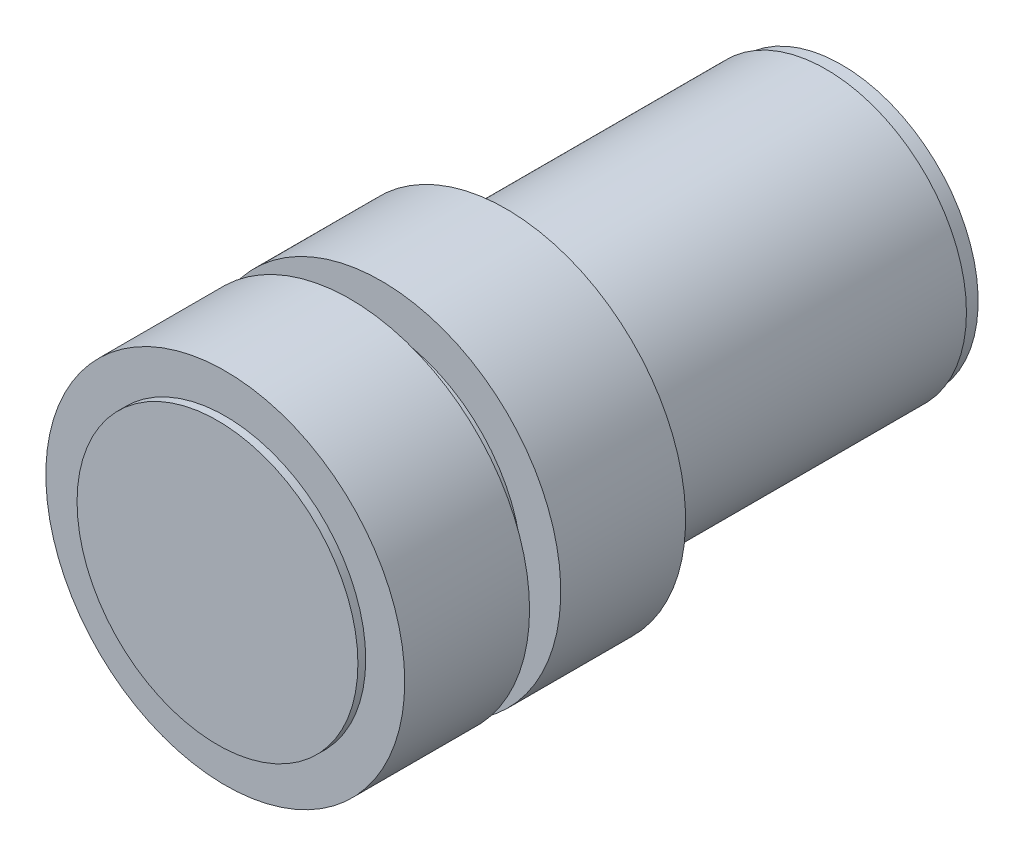
ISO-10303-21;
HEADER;
FILE_DESCRIPTION(('STEP AP214'),'2;1');
FILE_NAME('part.step','',(''),(''),'','','');
FILE_SCHEMA(('AUTOMOTIVE_DESIGN { 1 0 10303 214 1 1 1 1 }'));
ENDSEC;
DATA;
#1=APPLICATION_CONTEXT('core data for automotive mechanical design processes');
#2=APPLICATION_PROTOCOL_DEFINITION('international standard','automotive_design',2000,#1);
#3=PRODUCT_CONTEXT('',#1,'mechanical');
#4=PRODUCT('Part','Part','',(#3));
#5=PRODUCT_RELATED_PRODUCT_CATEGORY('part','',(#4));
#6=PRODUCT_DEFINITION_FORMATION('','',#4);
#7=PRODUCT_DEFINITION_CONTEXT('part definition',#1,'design');
#8=PRODUCT_DEFINITION('design','',#6,#7);
#9=PRODUCT_DEFINITION_SHAPE('','',#8);
#10=(LENGTH_UNIT() NAMED_UNIT(*) SI_UNIT(.MILLI.,.METRE.));
#11=(NAMED_UNIT(*) PLANE_ANGLE_UNIT() SI_UNIT($,.RADIAN.));
#12=(NAMED_UNIT(*) SI_UNIT($,.STERADIAN.) SOLID_ANGLE_UNIT());
#13=UNCERTAINTY_MEASURE_WITH_UNIT(LENGTH_MEASURE(1.E-05),#10,'distance_accuracy_value','');
#14=(GEOMETRIC_REPRESENTATION_CONTEXT(3) GLOBAL_UNCERTAINTY_ASSIGNED_CONTEXT((#13)) GLOBAL_UNIT_ASSIGNED_CONTEXT((#10,
#11,#12)) REPRESENTATION_CONTEXT('',''));
#15=CARTESIAN_POINT('',(0.,0.,0.));
#16=DIRECTION('',(0.,0.,1.));
#17=DIRECTION('',(1.,0.,0.));
#18=AXIS2_PLACEMENT_3D('',#15,#16,#17);
#19=CARTESIAN_POINT('',(0.,0.,40.));
#20=DIRECTION('',(0.,0.,-1.));
#21=DIRECTION('',(-1.,0.,0.));
#22=AXIS2_PLACEMENT_3D('',#19,#20,#21);
#23=CYLINDRICAL_SURFACE('',#22,9.);
#24=CARTESIAN_POINT('',(0.,0.,21.5));
#25=DIRECTION('',(0.,0.,-1.));
#26=DIRECTION('',(-1.,0.,0.));
#27=AXIS2_PLACEMENT_3D('',#24,#25,#26);
#28=CIRCLE('',#27,9.);
#29=CARTESIAN_POINT('',(-9.,0.,21.5));
#30=VERTEX_POINT('',#29);
#31=EDGE_CURVE('E36',#30,#30,#28,.T.);
#32=ORIENTED_EDGE('',*,*,#31,.T.);
#33=EDGE_LOOP('',(#32));
#34=FACE_BOUND('',#33,.T.);
#35=CARTESIAN_POINT('',(0.,0.,1.));
#36=DIRECTION('',(0.,0.,-1.));
#37=DIRECTION('',(-1.,0.,0.));
#38=AXIS2_PLACEMENT_3D('',#35,#36,#37);
#39=CIRCLE('',#38,9.);
#40=CARTESIAN_POINT('',(-9.,0.,1.));
#41=VERTEX_POINT('',#40);
#42=EDGE_CURVE('E62',#41,#41,#39,.T.);
#43=ORIENTED_EDGE('',*,*,#42,.F.);
#44=EDGE_LOOP('',(#43));
#45=FACE_BOUND('',#44,.T.);
#46=ADVANCED_FACE('F32',(#34,#45),#23,.T.);
#47=CARTESIAN_POINT('',(0.,0.,31.5));
#48=DIRECTION('',(0.,0.,1.));
#49=DIRECTION('',(1.,0.,0.));
#50=AXIS2_PLACEMENT_3D('',#47,#48,#49);
#51=CIRCLE('',#50,9.);
#52=CARTESIAN_POINT('',(9.,0.,31.5));
#53=VERTEX_POINT('',#52);
#54=EDGE_CURVE('E40',#53,#53,#51,.T.);
#55=ORIENTED_EDGE('',*,*,#54,.F.);
#56=EDGE_LOOP('',(#55));
#57=FACE_BOUND('',#56,.T.);
#58=CARTESIAN_POINT('',(0.,0.,29.5));
#59=DIRECTION('',(0.,0.,-1.));
#60=DIRECTION('',(-1.,0.,0.));
#61=AXIS2_PLACEMENT_3D('',#58,#59,#60);
#62=CIRCLE('',#61,9.);
#63=CARTESIAN_POINT('',(-9.,0.,29.5));
#64=VERTEX_POINT('',#63);
#65=EDGE_CURVE('E10',#64,#64,#62,.T.);
#66=ORIENTED_EDGE('',*,*,#65,.F.);
#67=EDGE_LOOP('',(#66));
#68=FACE_BOUND('',#67,.T.);
#69=ADVANCED_FACE('F85',(#57,#68),#23,.T.);
#70=CARTESIAN_POINT('',(0.,0.,31.5));
#71=DIRECTION('',(0.,0.,1.));
#72=DIRECTION('',(1.,0.,0.));
#73=AXIS2_PLACEMENT_3D('',#70,#71,#72);
#74=CYLINDRICAL_SURFACE('',#73,11.5);
#75=CARTESIAN_POINT('',(0.,0.,31.5));
#76=DIRECTION('',(0.,0.,1.));
#77=DIRECTION('',(1.,0.,0.));
#78=AXIS2_PLACEMENT_3D('',#75,#76,#77);
#79=CIRCLE('',#78,11.5);
#80=CARTESIAN_POINT('',(11.5,0.,31.5));
#81=VERTEX_POINT('',#80);
#82=EDGE_CURVE('E50',#81,#81,#79,.T.);
#83=ORIENTED_EDGE('',*,*,#82,.T.);
#84=EDGE_LOOP('',(#83));
#85=FACE_BOUND('',#84,.T.);
#86=CARTESIAN_POINT('',(0.,0.,39.5));
#87=DIRECTION('',(0.,0.,1.));
#88=DIRECTION('',(1.,0.,0.));
#89=AXIS2_PLACEMENT_3D('',#86,#87,#88);
#90=CIRCLE('',#89,11.5);
#91=CARTESIAN_POINT('',(11.5,0.,39.5));
#92=VERTEX_POINT('',#91);
#93=EDGE_CURVE('E53',#92,#92,#90,.T.);
#94=ORIENTED_EDGE('',*,*,#93,.F.);
#95=EDGE_LOOP('',(#94));
#96=FACE_BOUND('',#95,.T.);
#97=ADVANCED_FACE('F90',(#85,#96),#74,.T.);
#98=CARTESIAN_POINT('',(0.,0.,31.5));
#99=DIRECTION('',(0.,0.,1.));
#100=DIRECTION('',(1.,0.,0.));
#101=AXIS2_PLACEMENT_3D('',#98,#99,#100);
#102=PLANE('',#101);
#103=ORIENTED_EDGE('',*,*,#54,.T.);
#104=EDGE_LOOP('',(#103));
#105=FACE_BOUND('',#104,.T.);
#106=ORIENTED_EDGE('',*,*,#82,.F.);
#107=EDGE_LOOP('',(#106));
#108=FACE_BOUND('',#107,.T.);
#109=ADVANCED_FACE('F113',(#105,#108),#102,.F.);
#110=CARTESIAN_POINT('',(0.,0.,39.5));
#111=DIRECTION('',(0.,0.,1.));
#112=DIRECTION('',(1.,0.,0.));
#113=AXIS2_PLACEMENT_3D('',#110,#111,#112);
#114=PLANE('',#113);
#115=CARTESIAN_POINT('',(0.,0.,39.5));
#116=DIRECTION('',(0.,0.,1.));
#117=DIRECTION('',(1.,0.,0.));
#118=AXIS2_PLACEMENT_3D('',#115,#116,#117);
#119=CIRCLE('',#118,9.);
#120=CARTESIAN_POINT('',(9.,0.,39.5));
#121=VERTEX_POINT('',#120);
#122=EDGE_CURVE('E47',#121,#121,#119,.T.);
#123=ORIENTED_EDGE('',*,*,#122,.F.);
#124=EDGE_LOOP('',(#123));
#125=FACE_BOUND('',#124,.T.);
#126=ORIENTED_EDGE('',*,*,#93,.T.);
#127=EDGE_LOOP('',(#126));
#128=FACE_BOUND('',#127,.T.);
#129=ADVANCED_FACE('F104',(#125,#128),#114,.T.);
#130=CARTESIAN_POINT('',(0.,0.,40.));
#131=DIRECTION('',(0.,0.,1.));
#132=DIRECTION('',(1.,0.,0.));
#133=AXIS2_PLACEMENT_3D('',#130,#131,#132);
#134=PLANE('',#133);
#135=CARTESIAN_POINT('',(0.,0.,40.));
#136=DIRECTION('',(0.,0.,1.));
#137=DIRECTION('',(1.,0.,0.));
#138=AXIS2_PLACEMENT_3D('',#135,#136,#137);
#139=CIRCLE('',#138,9.);
#140=CARTESIAN_POINT('',(9.,0.,40.));
#141=VERTEX_POINT('',#140);
#142=EDGE_CURVE('E44',#141,#141,#139,.T.);
#143=ORIENTED_EDGE('',*,*,#142,.T.);
#144=EDGE_LOOP('',(#143));
#145=FACE_BOUND('',#144,.T.);
#146=ADVANCED_FACE('F95',(#145),#134,.T.);
#147=ORIENTED_EDGE('',*,*,#122,.T.);
#148=EDGE_LOOP('',(#147));
#149=FACE_BOUND('',#148,.T.);
#150=ORIENTED_EDGE('',*,*,#142,.F.);
#151=EDGE_LOOP('',(#150));
#152=FACE_BOUND('',#151,.T.);
#153=ADVANCED_FACE('F34',(#149,#152),#23,.T.);
#154=CARTESIAN_POINT('',(0.,0.,21.5));
#155=DIRECTION('',(0.,0.,1.));
#156=DIRECTION('',(1.,0.,0.));
#157=AXIS2_PLACEMENT_3D('',#154,#155,#156);
#158=CYLINDRICAL_SURFACE('',#157,11.5);
#159=CARTESIAN_POINT('',(0.,0.,21.5));
#160=DIRECTION('',(0.,0.,-1.));
#161=DIRECTION('',(-1.,0.,0.));
#162=AXIS2_PLACEMENT_3D('',#159,#160,#161);
#163=CIRCLE('',#162,11.5);
#164=CARTESIAN_POINT('',(-11.5,0.,21.5));
#165=VERTEX_POINT('',#164);
#166=EDGE_CURVE('E61',#165,#165,#163,.T.);
#167=ORIENTED_EDGE('',*,*,#166,.F.);
#168=EDGE_LOOP('',(#167));
#169=FACE_BOUND('',#168,.T.);
#170=CARTESIAN_POINT('',(0.,0.,29.5));
#171=DIRECTION('',(0.,0.,-1.));
#172=DIRECTION('',(-1.,0.,0.));
#173=AXIS2_PLACEMENT_3D('',#170,#171,#172);
#174=CIRCLE('',#173,11.5);
#175=CARTESIAN_POINT('',(-11.5,0.,29.5));
#176=VERTEX_POINT('',#175);
#177=EDGE_CURVE('E58',#176,#176,#174,.T.);
#178=ORIENTED_EDGE('',*,*,#177,.T.);
#179=EDGE_LOOP('',(#178));
#180=FACE_BOUND('',#179,.T.);
#181=ADVANCED_FACE('F94',(#169,#180),#158,.T.);
#182=CARTESIAN_POINT('',(0.,0.,21.5));
#183=DIRECTION('',(0.,0.,-1.));
#184=DIRECTION('',(-1.,0.,0.));
#185=AXIS2_PLACEMENT_3D('',#182,#183,#184);
#186=PLANE('',#185);
#187=ORIENTED_EDGE('',*,*,#31,.F.);
#188=EDGE_LOOP('',(#187));
#189=FACE_BOUND('',#188,.T.);
#190=ORIENTED_EDGE('',*,*,#166,.T.);
#191=EDGE_LOOP('',(#190));
#192=FACE_BOUND('',#191,.T.);
#193=ADVANCED_FACE('F101',(#189,#192),#186,.T.);
#194=CARTESIAN_POINT('',(0.,0.,29.5));
#195=DIRECTION('',(0.,0.,-1.));
#196=DIRECTION('',(-1.,0.,0.));
#197=AXIS2_PLACEMENT_3D('',#194,#195,#196);
#198=PLANE('',#197);
#199=ORIENTED_EDGE('',*,*,#65,.T.);
#200=EDGE_LOOP('',(#199));
#201=FACE_BOUND('',#200,.T.);
#202=ORIENTED_EDGE('',*,*,#177,.F.);
#203=EDGE_LOOP('',(#202));
#204=FACE_BOUND('',#203,.T.);
#205=ADVANCED_FACE('F80',(#201,#204),#198,.F.);
#206=CARTESIAN_POINT('',(0.,0.,1.));
#207=DIRECTION('',(0.,0.,-1.));
#208=DIRECTION('',(-1.,0.,0.));
#209=AXIS2_PLACEMENT_3D('',#206,#207,#208);
#210=PLANE('',#209);
#211=CARTESIAN_POINT('',(0.,0.,1.));
#212=DIRECTION('',(0.,0.,-1.));
#213=DIRECTION('',(-1.,0.,0.));
#214=AXIS2_PLACEMENT_3D('',#211,#212,#213);
#215=CIRCLE('',#214,8.75);
#216=CARTESIAN_POINT('',(-8.75,0.,1.));
#217=VERTEX_POINT('',#216);
#218=EDGE_CURVE('E67',#217,#217,#215,.T.);
#219=ORIENTED_EDGE('',*,*,#218,.F.);
#220=EDGE_LOOP('',(#219));
#221=FACE_BOUND('',#220,.T.);
#222=ORIENTED_EDGE('',*,*,#42,.T.);
#223=EDGE_LOOP('',(#222));
#224=FACE_BOUND('',#223,.T.);
#225=ADVANCED_FACE('F77',(#221,#224),#210,.T.);
#226=CARTESIAN_POINT('',(0.,0.,1.));
#227=DIRECTION('',(0.,0.,-1.));
#228=DIRECTION('',(-1.,0.,0.));
#229=AXIS2_PLACEMENT_3D('',#226,#227,#228);
#230=CYLINDRICAL_SURFACE('',#229,8.75);
#231=ORIENTED_EDGE('',*,*,#218,.T.);
#232=EDGE_LOOP('',(#231));
#233=FACE_BOUND('',#232,.T.);
#234=CARTESIAN_POINT('',(0.,0.,0.));
#235=DIRECTION('',(0.,0.,-1.));
#236=DIRECTION('',(-1.,0.,0.));
#237=AXIS2_PLACEMENT_3D('',#234,#235,#236);
#238=CIRCLE('',#237,8.75);
#239=CARTESIAN_POINT('',(-8.75,0.,0.));
#240=VERTEX_POINT('',#239);
#241=EDGE_CURVE('E68',#240,#240,#238,.T.);
#242=ORIENTED_EDGE('',*,*,#241,.F.);
#243=EDGE_LOOP('',(#242));
#244=FACE_BOUND('',#243,.T.);
#245=ADVANCED_FACE('F74',(#233,#244),#230,.T.);
#246=CARTESIAN_POINT('',(0.,0.,0.));
#247=DIRECTION('',(0.,0.,1.));
#248=DIRECTION('',(1.,0.,0.));
#249=AXIS2_PLACEMENT_3D('',#246,#247,#248);
#250=PLANE('',#249);
#251=ORIENTED_EDGE('',*,*,#241,.T.);
#252=EDGE_LOOP('',(#251));
#253=FACE_BOUND('',#252,.T.);
#254=ADVANCED_FACE('F125',(#253),#250,.F.);
#255=CLOSED_SHELL('',(#46,#69,#97,#109,#129,#146,#153,#181,#193,#205,#225,#245,#254));
#256=MANIFOLD_SOLID_BREP('B2',#255);
#257=ADVANCED_BREP_SHAPE_REPRESENTATION('',(#18,#256),#14);
#258=SHAPE_DEFINITION_REPRESENTATION(#9,#257);
ENDSEC;
END-ISO-10303-21;
